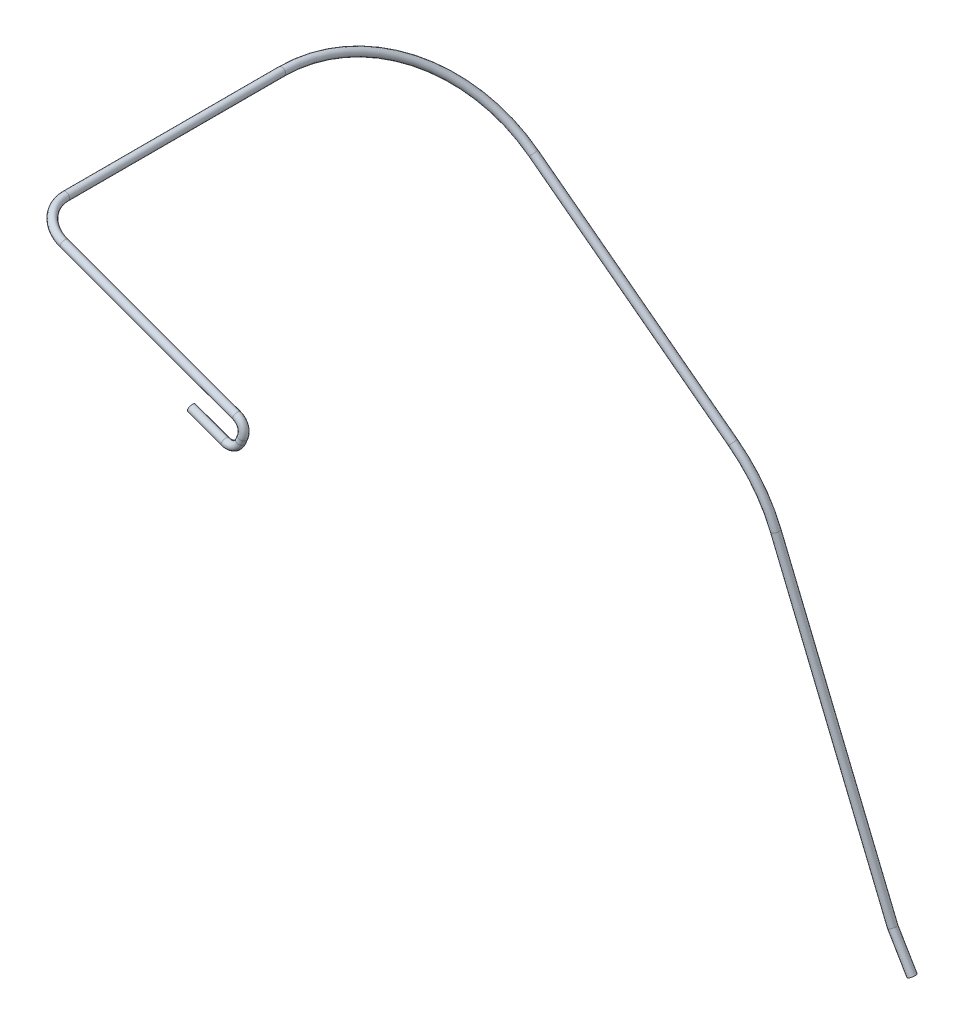
ISO-10303-21;
HEADER;
FILE_DESCRIPTION(('STEP AP214'),'2;1');
FILE_NAME('part.step','',(''),(''),'','','');
FILE_SCHEMA(('AUTOMOTIVE_DESIGN { 1 0 10303 214 1 1 1 1 }'));
ENDSEC;
DATA;
#1=APPLICATION_CONTEXT('core data for automotive mechanical design processes');
#2=APPLICATION_PROTOCOL_DEFINITION('international standard','automotive_design',2000,#1);
#3=PRODUCT_CONTEXT('',#1,'mechanical');
#4=PRODUCT('Part','Part','',(#3));
#5=PRODUCT_RELATED_PRODUCT_CATEGORY('part','',(#4));
#6=PRODUCT_DEFINITION_FORMATION('','',#4);
#7=PRODUCT_DEFINITION_CONTEXT('part definition',#1,'design');
#8=PRODUCT_DEFINITION('design','',#6,#7);
#9=PRODUCT_DEFINITION_SHAPE('','',#8);
#10=(LENGTH_UNIT() NAMED_UNIT(*) SI_UNIT(.MILLI.,.METRE.));
#11=(NAMED_UNIT(*) PLANE_ANGLE_UNIT() SI_UNIT($,.RADIAN.));
#12=(NAMED_UNIT(*) SI_UNIT($,.STERADIAN.) SOLID_ANGLE_UNIT());
#13=UNCERTAINTY_MEASURE_WITH_UNIT(LENGTH_MEASURE(1.E-05),#10,'distance_accuracy_value','');
#14=(GEOMETRIC_REPRESENTATION_CONTEXT(3) GLOBAL_UNCERTAINTY_ASSIGNED_CONTEXT((#13)) GLOBAL_UNIT_ASSIGNED_CONTEXT((#10,
#11,#12)) REPRESENTATION_CONTEXT('',''));
#15=CARTESIAN_POINT('',(0.,0.,0.));
#16=DIRECTION('',(0.,0.,1.));
#17=DIRECTION('',(1.,0.,0.));
#18=AXIS2_PLACEMENT_3D('',#15,#16,#17);
#19=CARTESIAN_POINT('',(345.043830556534,-756.942779989753,-586.820511540821));
#20=DIRECTION('',(-0.467929206614303,0.883139819589406,0.0332613387118007));
#21=DIRECTION('',(-0.883628741448249,-0.468188260517694,0.));
#22=AXIS2_PLACEMENT_3D('',#19,#20,#21);
#23=PLANE('',#22);
#24=CARTESIAN_POINT('',(345.043830556534,-756.942779989753,-586.820511540821));
#25=DIRECTION('',(-0.467929206614303,0.883139819589406,0.0332613387118007));
#26=DIRECTION('',(-0.883628741448249,-0.468188260517694,0.));
#27=AXIS2_PLACEMENT_3D('',#24,#25,#26);
#28=CIRCLE('',#27,4.00000000000004);
#29=CARTESIAN_POINT('',(341.509315590741,-758.815533031824,-586.820511540821));
#30=VERTEX_POINT('',#29);
#31=EDGE_CURVE('E83',#30,#30,#28,.T.);
#32=ORIENTED_EDGE('',*,*,#31,.T.);
#33=EDGE_LOOP('',(#32));
#34=FACE_BOUND('',#33,.T.);
#35=CARTESIAN_POINT('',(345.043830556534,-756.942779989753,-586.820511540821));
#36=DIRECTION('',(-0.467929206614303,0.883139819589406,0.0332613387118007));
#37=DIRECTION('',(-0.883628741448249,-0.468188260517694,0.));
#38=AXIS2_PLACEMENT_3D('',#35,#36,#37);
#39=CIRCLE('',#38,5.00000000000004);
#40=CARTESIAN_POINT('',(340.625686849293,-759.283721292342,-586.820511540821));
#41=VERTEX_POINT('',#40);
#42=EDGE_CURVE('E50',#41,#41,#39,.T.);
#43=ORIENTED_EDGE('',*,*,#42,.F.);
#44=EDGE_LOOP('',(#43));
#45=FACE_BOUND('',#44,.T.);
#46=ADVANCED_FACE('F47',(#34,#45),#23,.F.);
#47=CARTESIAN_POINT('',(-3.33066907387547E-13,-1.11022302462516E-13,0.));
#48=DIRECTION('',(-0.93969262078591,0.342020143325666,0.));
#49=DIRECTION('',(0.324832866004658,0.892470964444532,0.313016272399128));
#50=AXIS2_PLACEMENT_3D('',#47,#48,#49);
#51=PLANE('',#50);
#52=CARTESIAN_POINT('',(-3.33066907387547E-13,-1.11022302462516E-13,0.));
#53=DIRECTION('',(-0.93969262078591,0.342020143325666,0.));
#54=DIRECTION('',(-0.342020143325666,-0.939692620785909,0.));
#55=AXIS2_PLACEMENT_3D('',#52,#53,#54);
#56=CIRCLE('',#55,4.00000000000004);
#57=CARTESIAN_POINT('',(-1.36808057330301,-3.75877048314379,0.));
#58=VERTEX_POINT('',#57);
#59=EDGE_CURVE('E71',#58,#58,#56,.T.);
#60=ORIENTED_EDGE('',*,*,#59,.F.);
#61=EDGE_LOOP('',(#60));
#62=FACE_BOUND('',#61,.T.);
#63=CARTESIAN_POINT('',(-3.33066907387547E-13,-1.11022302462516E-13,0.));
#64=DIRECTION('',(-0.93969262078591,0.342020143325666,0.));
#65=DIRECTION('',(0.324832866004658,0.892470964444532,0.313016272399128));
#66=AXIS2_PLACEMENT_3D('',#63,#64,#65);
#67=CIRCLE('',#66,5.00000000000004);
#68=CARTESIAN_POINT('',(1.62416433002297,4.46235482222259,1.56508136199565));
#69=VERTEX_POINT('',#68);
#70=EDGE_CURVE('E11',#69,#69,#67,.T.);
#71=ORIENTED_EDGE('',*,*,#70,.T.);
#72=EDGE_LOOP('',(#71));
#73=FACE_BOUND('',#72,.T.);
#74=ADVANCED_FACE('F146',(#62,#73),#51,.T.);
#75=CARTESIAN_POINT('',(321.312445977381,-712.153674288312,-585.133637523492));
#76=DIRECTION('',(0.467929206614306,-0.883139819589404,-0.033261338711803));
#77=DIRECTION('',(0.883628741448247,0.468188260517697,0.));
#78=AXIS2_PLACEMENT_3D('',#75,#76,#77);
#79=CYLINDRICAL_SURFACE('',#78,5.00000000000004);
#80=CARTESIAN_POINT('',(321.647370225819,-712.785789010283,-585.157444605231));
#81=DIRECTION('',(0.389753622954663,-0.919780760214602,-0.0457762660421624));
#82=DIRECTION('',(-0.913981240403804,-0.380249150525052,-0.141594052540705));
#83=AXIS2_PLACEMENT_3D('',#80,#81,#82);
#84=ELLIPSE('',#83,5.01909918771678,5.00000000000004);
#85=CARTESIAN_POINT('',(317.06000772452,-714.694297212813,-585.868119199324));
#86=VERTEX_POINT('',#85);
#87=EDGE_CURVE('E62',#86,#86,#84,.T.);
#88=ORIENTED_EDGE('',*,*,#87,.T.);
#89=EDGE_LOOP('',(#88));
#90=FACE_BOUND('',#89,.T.);
#91=ORIENTED_EDGE('',*,*,#42,.T.);
#92=EDGE_LOOP('',(#91));
#93=FACE_BOUND('',#92,.T.);
#94=ADVANCED_FACE('F144',(#90,#93),#79,.T.);
#95=CARTESIAN_POINT('',(-3.33066907387547E-13,-1.11022302462516E-13,0.));
#96=DIRECTION('',(0.939692620785908,-0.342020143325669,0.));
#97=DIRECTION('',(0.342020143325669,0.939692620785908,0.));
#98=AXIS2_PLACEMENT_3D('',#95,#96,#97);
#99=CYLINDRICAL_SURFACE('',#98,5.00000000000004);
#100=CARTESIAN_POINT('',(43.4798706958059,-15.8253787230169,0.));
#101=DIRECTION('',(-0.93969262078591,0.342020143325666,0.));
#102=DIRECTION('',(0.324832866004658,0.892470964444532,0.313016272399128));
#103=AXIS2_PLACEMENT_3D('',#100,#101,#102);
#104=CIRCLE('',#103,5.00000000000004);
#105=CARTESIAN_POINT('',(41.7747755659462,-20.5100890903283,0.382281797282093));
#106=VERTEX_POINT('',#105);
#107=EDGE_CURVE('E54',#106,#106,#104,.T.);
#108=ORIENTED_EDGE('',*,*,#107,.T.);
#109=EDGE_LOOP('',(#108));
#110=FACE_BOUND('',#109,.T.);
#111=ORIENTED_EDGE('',*,*,#70,.F.);
#112=EDGE_LOOP('',(#111));
#113=FACE_BOUND('',#112,.T.);
#114=ADVANCED_FACE('F122',(#110,#113),#99,.T.);
#115=CARTESIAN_POINT('',(48.5951560853853,-1.77124762108241,-1.14684539184631));
#116=DIRECTION('',(0.0261496150194436,0.0718454767933526,0.997072928676068));
#117=DIRECTION('',(0.,-0.997414004020819,0.0718700534517508));
#118=AXIS2_PLACEMENT_3D('',#115,#116,#117);
#119=TOROIDAL_SURFACE('',#118,15.0000000000001,5.00000000000004);
#120=CARTESIAN_POINT('',(62.7095999836149,-6.8488902831555,-1.15113957734297));
#121=DIRECTION('',(-0.337498101469267,-0.938216147035957,0.0764558234907233));
#122=DIRECTION('',(-0.858482241468479,0.340096345750314,0.383852467349811));
#123=AXIS2_PLACEMENT_3D('',#120,#121,#122);
#124=CIRCLE('',#123,5.00000000000004);
#125=CARTESIAN_POINT('',(67.414414616358,-8.54143783717984,-1.15257097250853));
#126=VERTEX_POINT('',#125);
#127=EDGE_CURVE('E59',#126,#126,#124,.T.);
#128=CARTESIAN_POINT('',(48.5951560853853,-1.77124762108241,-1.14684539184631));
#129=DIRECTION('',(0.0261496150194436,0.0718454767933526,0.997072928676068));
#130=DIRECTION('',(0.,-0.997414004020819,0.0718700534517508));
#131=AXIS2_PLACEMENT_3D('',#128,#129,#130);
#132=CIRCLE('',#131,20.0000000000001);
#133=EDGE_CURVE('',#106,#126,#132,.T.);
#134=ORIENTED_EDGE('',*,*,#107,.F.);
#135=ORIENTED_EDGE('',*,*,#127,.T.);
#136=ORIENTED_EDGE('',*,*,#133,.T.);
#137=ORIENTED_EDGE('',*,*,#133,.F.);
#138=EDGE_LOOP('',(#134,#136,#135,#137));
#139=FACE_BOUND('',#138,.T.);
#140=ADVANCED_FACE('F107',(#139),#119,.T.);
#141=CARTESIAN_POINT('',(62.7095999836148,-6.8488902831555,-1.15113957734286));
#142=DIRECTION('',(0.33749810146927,0.938216147035956,-0.0764558234907223));
#143=DIRECTION('',(-0.940970395826116,0.338488868618812,0.));
#144=AXIS2_PLACEMENT_3D('',#141,#142,#143);
#145=CYLINDRICAL_SURFACE('',#144,5.00000000000004);
#146=CARTESIAN_POINT('',(64.7250193505446,-1.24619508318036,-1.60770673048227));
#147=DIRECTION('',(-0.337498101469267,-0.938216147035957,0.0764558234907233));
#148=DIRECTION('',(-0.858482241468479,0.340096345750314,0.383852467349811));
#149=AXIS2_PLACEMENT_3D('',#146,#147,#148);
#150=CIRCLE('',#149,5.00000000000004);
#151=CARTESIAN_POINT('',(69.4298339832879,-2.93874263720474,-1.60913812564779));
#152=VERTEX_POINT('',#151);
#153=EDGE_CURVE('E102',#152,#152,#150,.T.);
#154=ORIENTED_EDGE('',*,*,#153,.T.);
#155=EDGE_LOOP('',(#154));
#156=FACE_BOUND('',#155,.T.);
#157=ORIENTED_EDGE('',*,*,#127,.F.);
#158=EDGE_LOOP('',(#157));
#159=FACE_BOUND('',#158,.T.);
#160=ADVANCED_FACE('F110',(#156,#159),#145,.T.);
#161=CARTESIAN_POINT('',(50.6105754523151,3.83144757889267,-1.60341254498572));
#162=DIRECTION('',(0.0261496150194436,0.0718454767933526,0.997072928676068));
#163=DIRECTION('',(0.,-0.997414004020819,0.0718700534517508));
#164=AXIS2_PLACEMENT_3D('',#161,#162,#163);
#165=TOROIDAL_SURFACE('',#164,15.0000000000001,5.00000000000004);
#166=CARTESIAN_POINT('',(55.7258608418943,17.8855786808271,-2.75025793683226));
#167=DIRECTION('',(0.93969262078591,-0.342020143325666,0.));
#168=DIRECTION('',(-0.304712603921738,-0.837190998698202,0.454160170765711));
#169=AXIS2_PLACEMENT_3D('',#166,#167,#168);
#170=CIRCLE('',#169,5.00000000000004);
#171=CARTESIAN_POINT('',(57.4309559717541,22.5702890481386,-3.13253973411444));
#172=VERTEX_POINT('',#171);
#173=EDGE_CURVE('E99',#172,#172,#170,.T.);
#174=CARTESIAN_POINT('',(50.6105754523151,3.83144757889267,-1.60341254498572));
#175=DIRECTION('',(0.0261496150194436,0.0718454767933526,0.997072928676068));
#176=DIRECTION('',(0.,-0.997414004020819,0.0718700534517508));
#177=AXIS2_PLACEMENT_3D('',#174,#175,#176);
#178=CIRCLE('',#177,20.0000000000002);
#179=EDGE_CURVE('',#152,#172,#178,.T.);
#180=ORIENTED_EDGE('',*,*,#153,.F.);
#181=ORIENTED_EDGE('',*,*,#173,.T.);
#182=ORIENTED_EDGE('',*,*,#179,.T.);
#183=ORIENTED_EDGE('',*,*,#179,.F.);
#184=EDGE_LOOP('',(#180,#182,#181,#183));
#185=FACE_BOUND('',#184,.T.);
#186=ADVANCED_FACE('F112',(#185),#165,.T.);
#187=CARTESIAN_POINT('',(55.7258608418943,17.885578680827,-2.75025793683215));
#188=DIRECTION('',(-0.939692620785908,0.34202014332567,0.));
#189=DIRECTION('',(-0.34202014332567,-0.939692620785908,0.));
#190=AXIS2_PLACEMENT_3D('',#187,#188,#189);
#191=CYLINDRICAL_SURFACE('',#190,5.00000000000004);
#192=CARTESIAN_POINT('',(-167.617948508894,99.1760772921397,-2.75025793683215));
#193=DIRECTION('',(0.93969262078591,-0.342020143325666,0.));
#194=DIRECTION('',(-0.304712603921738,-0.837190998698202,0.454160170765711));
#195=AXIS2_PLACEMENT_3D('',#192,#193,#194);
#196=CIRCLE('',#195,5.00000000000004);
#197=CARTESIAN_POINT('',(-167.617948508894,99.1760772921397,2.249742063168));
#198=VERTEX_POINT('',#197);
#199=EDGE_CURVE('E96',#198,#198,#196,.T.);
#200=ORIENTED_EDGE('',*,*,#199,.T.);
#201=EDGE_LOOP('',(#200));
#202=FACE_BOUND('',#201,.T.);
#203=ORIENTED_EDGE('',*,*,#173,.F.);
#204=EDGE_LOOP('',(#203));
#205=FACE_BOUND('',#204,.T.);
#206=ADVANCED_FACE('F119',(#202,#205),#191,.T.);
#207=CARTESIAN_POINT('',(-167.617948508894,99.1760772921399,-42.750257936832));
#208=DIRECTION('',(-0.342020143325669,-0.939692620785908,0.));
#209=DIRECTION('',(0.939692620785909,-0.342020143325669,0.));
#210=AXIS2_PLACEMENT_3D('',#207,#208,#209);
#211=TOROIDAL_SURFACE('',#210,39.9999999999999,5.00000000000004);
#212=CARTESIAN_POINT('',(-205.20565334033,112.856883025167,-42.7502579368317));
#213=DIRECTION('',(0.,0.,1.));
#214=DIRECTION('',(-0.731483565045148,-0.681859072000103,0.));
#215=AXIS2_PLACEMENT_3D('',#212,#213,#214);
#216=CIRCLE('',#215,5.00000000000004);
#217=CARTESIAN_POINT('',(-209.90411644426,114.566983741795,-42.7502579368317));
#218=VERTEX_POINT('',#217);
#219=EDGE_CURVE('E93',#218,#218,#216,.T.);
#220=CARTESIAN_POINT('',(-167.617948508894,99.1760772921399,-42.750257936832));
#221=DIRECTION('',(-0.342020143325669,-0.939692620785908,0.));
#222=DIRECTION('',(0.939692620785909,-0.342020143325669,0.));
#223=AXIS2_PLACEMENT_3D('',#220,#221,#222);
#224=CIRCLE('',#223,45.);
#225=EDGE_CURVE('',#198,#218,#224,.T.);
#226=ORIENTED_EDGE('',*,*,#199,.F.);
#227=ORIENTED_EDGE('',*,*,#219,.T.);
#228=ORIENTED_EDGE('',*,*,#225,.T.);
#229=ORIENTED_EDGE('',*,*,#225,.F.);
#230=EDGE_LOOP('',(#226,#228,#227,#229));
#231=FACE_BOUND('',#230,.T.);
#232=ADVANCED_FACE('F182',(#231),#211,.T.);
#233=CARTESIAN_POINT('',(-205.20565334033,112.856883025166,-42.7502579368316));
#234=DIRECTION('',(0.,0.,-1.));
#235=DIRECTION('',(-1.,0.,0.));
#236=AXIS2_PLACEMENT_3D('',#233,#234,#235);
#237=CYLINDRICAL_SURFACE('',#236,5.00000000000004);
#238=CARTESIAN_POINT('',(-205.20565334033,112.856883025167,-322.093656878126));
#239=DIRECTION('',(0.,0.,1.));
#240=DIRECTION('',(-0.731483565045147,-0.681859072000103,0.));
#241=AXIS2_PLACEMENT_3D('',#238,#239,#240);
#242=CIRCLE('',#241,5.00000000000004);
#243=CARTESIAN_POINT('',(-208.722785401874,116.410723491713,-322.093656878126));
#244=VERTEX_POINT('',#243);
#245=EDGE_CURVE('E90',#244,#244,#242,.T.);
#246=ORIENTED_EDGE('',*,*,#245,.T.);
#247=EDGE_LOOP('',(#246));
#248=FACE_BOUND('',#247,.T.);
#249=ORIENTED_EDGE('',*,*,#219,.F.);
#250=EDGE_LOOP('',(#249));
#251=FACE_BOUND('',#250,.T.);
#252=ADVANCED_FACE('F178',(#248,#251),#237,.T.);
#253=CARTESIAN_POINT('',(-64.5203708785941,-29.2967356366934,-322.093656878126));
#254=DIRECTION('',(-0.710768093309301,-0.70342641230868,0.));
#255=DIRECTION('',(0.70342641230868,-0.710768093309301,0.));
#256=AXIS2_PLACEMENT_3D('',#253,#254,#255);
#257=TOROIDAL_SURFACE('',#256,200.,5.00000000000004);
#258=CARTESIAN_POINT('',(-78.7816366389307,-14.8866246495564,-521.063415887508));
#259=DIRECTION('',(-0.699802918689459,0.707106781186549,0.101369990597381));
#260=DIRECTION('',(-0.712582424024966,-0.700957484754028,-0.0297471601671272));
#261=AXIS2_PLACEMENT_3D('',#258,#259,#260);
#262=CIRCLE('',#261,5.00000000000004);
#263=CARTESIAN_POINT('',(-79.1381682829391,-14.526371874878,-526.037659862743));
#264=VERTEX_POINT('',#263);
#265=EDGE_CURVE('E87',#264,#264,#262,.T.);
#266=CARTESIAN_POINT('',(-64.5203708785941,-29.2967356366934,-322.093656878126));
#267=DIRECTION('',(-0.710768093309301,-0.70342641230868,0.));
#268=DIRECTION('',(0.70342641230868,-0.710768093309301,0.));
#269=AXIS2_PLACEMENT_3D('',#266,#267,#268);
#270=CIRCLE('',#269,205.);
#271=EDGE_CURVE('',#244,#264,#270,.T.);
#272=ORIENTED_EDGE('',*,*,#245,.F.);
#273=ORIENTED_EDGE('',*,*,#265,.T.);
#274=ORIENTED_EDGE('',*,*,#271,.T.);
#275=ORIENTED_EDGE('',*,*,#271,.F.);
#276=EDGE_LOOP('',(#272,#274,#273,#275));
#277=FACE_BOUND('',#276,.T.);
#278=ADVANCED_FACE('F174',(#277),#257,.T.);
#279=CARTESIAN_POINT('',(-78.7816366389308,-14.8866246495566,-521.063415887508));
#280=DIRECTION('',(0.699802918689461,-0.707106781186547,-0.101369990597383));
#281=DIRECTION('',(0.710768093309301,0.70342641230868,0.));
#282=AXIS2_PLACEMENT_3D('',#279,#280,#281);
#283=CYLINDRICAL_SURFACE('',#282,5.00000000000004);
#284=CARTESIAN_POINT('',(146.440789385117,-242.459703388829,-553.688022899913));
#285=DIRECTION('',(-0.699802918689459,0.707106781186549,0.101369990597381));
#286=DIRECTION('',(-0.712582424024966,-0.700957484754029,-0.0297471601671273));
#287=AXIS2_PLACEMENT_3D('',#284,#285,#286);
#288=CIRCLE('',#287,5.00000000000004);
#289=CARTESIAN_POINT('',(149.959202803323,-238.92567043616,-554.050484081333));
#290=VERTEX_POINT('',#289);
#291=EDGE_CURVE('E68',#290,#290,#288,.T.);
#292=ORIENTED_EDGE('',*,*,#291,.T.);
#293=EDGE_LOOP('',(#292));
#294=FACE_BOUND('',#293,.T.);
#295=ORIENTED_EDGE('',*,*,#265,.F.);
#296=EDGE_LOOP('',(#295));
#297=FACE_BOUND('',#296,.T.);
#298=ADVANCED_FACE('F137',(#294,#297),#283,.T.);
#299=CARTESIAN_POINT('',(5.70425265688354,-383.8210214956,-539.189575643084));
#300=DIRECTION('',(-0.122908729296481,0.0206020284902761,-0.992204112410753));
#301=DIRECTION('',(-0.992414746796681,0.,0.12293482151319));
#302=AXIS2_PLACEMENT_3D('',#299,#300,#301);
#303=TOROIDAL_SURFACE('',#302,200.,5.00000000000004);
#304=CARTESIAN_POINT('',(194.347006474396,-321.155510876876,-561.256410736497));
#305=DIRECTION('',(-0.308611778884662,0.94942161387576,0.0579428083474728));
#306=DIRECTION('',(-0.95084802942752,-0.309557258373422,0.00789485415524105));
#307=AXIS2_PLACEMENT_3D('',#304,#305,#306);
#308=CIRCLE('',#307,5.00000000000004);
#309=CARTESIAN_POINT('',(199.063075319834,-319.588873111407,-561.808081613833));
#310=VERTEX_POINT('',#309);
#311=EDGE_CURVE('E64',#310,#310,#308,.T.);
#312=CARTESIAN_POINT('',(5.70425265688354,-383.8210214956,-539.189575643084));
#313=DIRECTION('',(-0.122908729296481,0.0206020284902761,-0.992204112410753));
#314=DIRECTION('',(-0.992414746796681,0.,0.12293482151319));
#315=AXIS2_PLACEMENT_3D('',#312,#313,#314);
#316=CIRCLE('',#315,205.);
#317=EDGE_CURVE('',#290,#310,#316,.T.);
#318=ORIENTED_EDGE('',*,*,#291,.F.);
#319=ORIENTED_EDGE('',*,*,#311,.T.);
#320=ORIENTED_EDGE('',*,*,#317,.T.);
#321=ORIENTED_EDGE('',*,*,#317,.F.);
#322=EDGE_LOOP('',(#318,#320,#319,#321));
#323=FACE_BOUND('',#322,.T.);
#324=ADVANCED_FACE('F127',(#323),#303,.T.);
#325=CARTESIAN_POINT('',(194.347006474396,-321.155510876876,-561.256410736497));
#326=DIRECTION('',(0.308611778884664,-0.949421613875759,-0.0579428083474757));
#327=DIRECTION('',(0.951019417681853,0.309131148854444,0.));
#328=AXIS2_PLACEMENT_3D('',#325,#326,#327);
#329=CYLINDRICAL_SURFACE('',#328,5.00000000000004);
#330=ORIENTED_EDGE('',*,*,#311,.F.);
#331=EDGE_LOOP('',(#330));
#332=FACE_BOUND('',#331,.T.);
#333=ORIENTED_EDGE('',*,*,#87,.F.);
#334=EDGE_LOOP('',(#333));
#335=FACE_BOUND('',#334,.T.);
#336=ADVANCED_FACE('F124',(#332,#335),#329,.T.);
#337=CARTESIAN_POINT('',(321.312445977381,-712.153674288312,-585.133637523492));
#338=DIRECTION('',(0.467929206614306,-0.883139819589404,-0.033261338711803));
#339=DIRECTION('',(0.883628741448247,0.468188260517697,0.));
#340=AXIS2_PLACEMENT_3D('',#337,#338,#339);
#341=CYLINDRICAL_SURFACE('',#340,4.00000000000004);
#342=CARTESIAN_POINT('',(321.647370225819,-712.785789010284,-585.157444605231));
#343=DIRECTION('',(0.389753622954663,-0.919780760214602,-0.0457762660421624));
#344=DIRECTION('',(0.913981240403804,0.380249150525052,0.141594052540705));
#345=AXIS2_PLACEMENT_3D('',#342,#343,#344);
#346=ELLIPSE('',#345,4.01527935017343,4.00000000000004);
#347=CARTESIAN_POINT('',(325.317260226858,-711.25898244826,-584.588904929957));
#348=VERTEX_POINT('',#347);
#349=EDGE_CURVE('E471',#348,#348,#346,.T.);
#350=ORIENTED_EDGE('',*,*,#349,.F.);
#351=EDGE_LOOP('',(#350));
#352=FACE_BOUND('',#351,.T.);
#353=ORIENTED_EDGE('',*,*,#31,.F.);
#354=EDGE_LOOP('',(#353));
#355=FACE_BOUND('',#354,.T.);
#356=ADVANCED_FACE('F126',(#352,#355),#341,.F.);
#357=CARTESIAN_POINT('',(-3.33066907387547E-13,-1.11022302462516E-13,0.));
#358=DIRECTION('',(0.939692620785908,-0.342020143325669,0.));
#359=DIRECTION('',(0.342020143325669,0.939692620785908,0.));
#360=AXIS2_PLACEMENT_3D('',#357,#358,#359);
#361=CYLINDRICAL_SURFACE('',#360,4.00000000000004);
#362=CARTESIAN_POINT('',(43.4798706958059,-15.8253787230169,0.));
#363=DIRECTION('',(0.939692620785908,-0.342020143325669,0.));
#364=DIRECTION('',(0.342020143325669,0.939692620785908,0.));
#365=AXIS2_PLACEMENT_3D('',#362,#363,#364);
#366=CIRCLE('',#365,4.00000000000004);
#367=CARTESIAN_POINT('',(42.1157945919182,-19.573147016866,0.305825437825672));
#368=VERTEX_POINT('',#367);
#369=EDGE_CURVE('E75',#368,#368,#366,.F.);
#370=ORIENTED_EDGE('',*,*,#369,.F.);
#371=EDGE_LOOP('',(#370));
#372=FACE_BOUND('',#371,.T.);
#373=ORIENTED_EDGE('',*,*,#59,.T.);
#374=EDGE_LOOP('',(#373));
#375=FACE_BOUND('',#374,.T.);
#376=ADVANCED_FACE('F134',(#372,#375),#361,.F.);
#377=CARTESIAN_POINT('',(48.5951560853853,-1.77124762108241,-1.14684539184631));
#378=DIRECTION('',(0.0261496150194436,0.0718454767933526,0.997072928676068));
#379=DIRECTION('',(0.,-0.997414004020819,0.0718700534517508));
#380=AXIS2_PLACEMENT_3D('',#377,#378,#379);
#381=TOROIDAL_SURFACE('',#380,15.0000000000001,4.00000000000004);
#382=CARTESIAN_POINT('',(62.7095999836148,-6.84889028315542,-1.15113957734287));
#383=DIRECTION('',(-0.33749810146928,-0.938216147035952,0.0764558234907223));
#384=DIRECTION('',(0.940970395826112,-0.338488868618822,0.));
#385=AXIS2_PLACEMENT_3D('',#382,#383,#384);
#386=CIRCLE('',#385,4.00000000000004);
#387=CARTESIAN_POINT('',(66.4734516898094,-8.20292832637489,-1.15228469347528));
#388=VERTEX_POINT('',#387);
#389=EDGE_CURVE('E80',#388,#388,#386,.T.);
#390=CARTESIAN_POINT('',(48.5951560853853,-1.77124762108241,-1.14684539184631));
#391=DIRECTION('',(0.0261496150194436,0.0718454767933526,0.997072928676068));
#392=DIRECTION('',(0.,-0.997414004020819,0.0718700534517508));
#393=AXIS2_PLACEMENT_3D('',#390,#391,#392);
#394=CIRCLE('',#393,19.0000000000001);
#395=EDGE_CURVE('',#368,#388,#394,.T.);
#396=ORIENTED_EDGE('',*,*,#369,.T.);
#397=ORIENTED_EDGE('',*,*,#389,.F.);
#398=ORIENTED_EDGE('',*,*,#395,.T.);
#399=ORIENTED_EDGE('',*,*,#395,.F.);
#400=EDGE_LOOP('',(#396,#398,#397,#399));
#401=FACE_BOUND('',#400,.T.);
#402=ADVANCED_FACE('F241',(#401),#381,.F.);
#403=CARTESIAN_POINT('',(62.7095999836148,-6.8488902831555,-1.15113957734286));
#404=DIRECTION('',(0.33749810146927,0.938216147035956,-0.0764558234907223));
#405=DIRECTION('',(-0.940970395826116,0.338488868618812,0.));
#406=AXIS2_PLACEMENT_3D('',#403,#404,#405);
#407=CYLINDRICAL_SURFACE('',#406,4.00000000000004);
#408=CARTESIAN_POINT('',(64.7250193505447,-1.24619508318038,-1.60770673048225));
#409=DIRECTION('',(0.33749810146927,0.938216147035956,-0.0764558234907223));
#410=DIRECTION('',(-0.940970395826116,0.338488868618812,0.));
#411=AXIS2_PLACEMENT_3D('',#408,#409,#410);
#412=CIRCLE('',#411,4.00000000000004);
#413=CARTESIAN_POINT('',(68.4888710567393,-2.60023312639989,-1.60885184661466));
#414=VERTEX_POINT('',#413);
#415=EDGE_CURVE('E454',#414,#414,#412,.F.);
#416=ORIENTED_EDGE('',*,*,#415,.F.);
#417=EDGE_LOOP('',(#416));
#418=FACE_BOUND('',#417,.T.);
#419=ORIENTED_EDGE('',*,*,#389,.T.);
#420=EDGE_LOOP('',(#419));
#421=FACE_BOUND('',#420,.T.);
#422=ADVANCED_FACE('F252',(#418,#421),#407,.F.);
#423=CARTESIAN_POINT('',(50.6105754523151,3.83144757889267,-1.60341254498572));
#424=DIRECTION('',(0.0261496150194436,0.0718454767933526,0.997072928676068));
#425=DIRECTION('',(0.,-0.997414004020819,0.0718700534517508));
#426=AXIS2_PLACEMENT_3D('',#423,#424,#425);
#427=TOROIDAL_SURFACE('',#426,15.0000000000001,4.00000000000004);
#428=CARTESIAN_POINT('',(55.7258608418943,17.8855786808272,-2.75025793683203));
#429=DIRECTION('',(0.939692620785905,-0.342020143325678,0.));
#430=DIRECTION('',(0.342020143325678,0.939692620785905,0.));
#431=AXIS2_PLACEMENT_3D('',#428,#429,#430);
#432=CIRCLE('',#431,4.00000000000004);
#433=CARTESIAN_POINT('',(57.0899369457821,21.6333469746764,-3.05608337465771));
#434=VERTEX_POINT('',#433);
#435=EDGE_CURVE('E451',#434,#434,#432,.T.);
#436=CARTESIAN_POINT('',(50.6105754523151,3.83144757889267,-1.60341254498572));
#437=DIRECTION('',(0.0261496150194436,0.0718454767933526,0.997072928676068));
#438=DIRECTION('',(0.,-0.997414004020819,0.0718700534517508));
#439=AXIS2_PLACEMENT_3D('',#436,#437,#438);
#440=CIRCLE('',#439,19.0000000000002);
#441=EDGE_CURVE('',#414,#434,#440,.T.);
#442=ORIENTED_EDGE('',*,*,#415,.T.);
#443=ORIENTED_EDGE('',*,*,#435,.F.);
#444=ORIENTED_EDGE('',*,*,#441,.T.);
#445=ORIENTED_EDGE('',*,*,#441,.F.);
#446=EDGE_LOOP('',(#442,#444,#443,#445));
#447=FACE_BOUND('',#446,.T.);
#448=ADVANCED_FACE('F263',(#447),#427,.F.);
#449=CARTESIAN_POINT('',(55.7258608418943,17.885578680827,-2.75025793683215));
#450=DIRECTION('',(-0.939692620785908,0.34202014332567,0.));
#451=DIRECTION('',(-0.34202014332567,-0.939692620785908,0.));
#452=AXIS2_PLACEMENT_3D('',#449,#450,#451);
#453=CYLINDRICAL_SURFACE('',#452,4.00000000000004);
#454=CARTESIAN_POINT('',(-167.617948508894,99.1760772921397,-2.75025793683215));
#455=DIRECTION('',(-0.939692620785908,0.34202014332567,0.));
#456=DIRECTION('',(-0.34202014332567,-0.939692620785908,0.));
#457=AXIS2_PLACEMENT_3D('',#454,#455,#456);
#458=CIRCLE('',#457,4.00000000000004);
#459=CARTESIAN_POINT('',(-167.617948508894,99.1760772921397,1.249742063168));
#460=VERTEX_POINT('',#459);
#461=EDGE_CURVE('E448',#460,#460,#458,.F.);
#462=ORIENTED_EDGE('',*,*,#461,.F.);
#463=EDGE_LOOP('',(#462));
#464=FACE_BOUND('',#463,.T.);
#465=ORIENTED_EDGE('',*,*,#435,.T.);
#466=EDGE_LOOP('',(#465));
#467=FACE_BOUND('',#466,.T.);
#468=ADVANCED_FACE('F274',(#464,#467),#453,.F.);
#469=CARTESIAN_POINT('',(-167.617948508894,99.1760772921399,-42.750257936832));
#470=DIRECTION('',(-0.342020143325669,-0.939692620785908,0.));
#471=DIRECTION('',(0.939692620785909,-0.342020143325669,0.));
#472=AXIS2_PLACEMENT_3D('',#469,#470,#471);
#473=TOROIDAL_SURFACE('',#472,39.9999999999999,4.00000000000004);
#474=CARTESIAN_POINT('',(-205.20565334033,112.856883025167,-42.7502579368317));
#475=DIRECTION('',(0.,0.,1.));
#476=DIRECTION('',(1.,0.,0.));
#477=AXIS2_PLACEMENT_3D('',#474,#475,#476);
#478=CIRCLE('',#477,4.00000000000004);
#479=CARTESIAN_POINT('',(-208.964423823474,114.224963598469,-42.7502579368317));
#480=VERTEX_POINT('',#479);
#481=EDGE_CURVE('E440',#480,#480,#478,.T.);
#482=CARTESIAN_POINT('',(-167.617948508894,99.1760772921399,-42.750257936832));
#483=DIRECTION('',(-0.342020143325669,-0.939692620785908,0.));
#484=DIRECTION('',(0.939692620785909,-0.342020143325669,0.));
#485=AXIS2_PLACEMENT_3D('',#482,#483,#484);
#486=CIRCLE('',#485,44.);
#487=EDGE_CURVE('',#460,#480,#486,.T.);
#488=ORIENTED_EDGE('',*,*,#461,.T.);
#489=ORIENTED_EDGE('',*,*,#481,.F.);
#490=ORIENTED_EDGE('',*,*,#487,.T.);
#491=ORIENTED_EDGE('',*,*,#487,.F.);
#492=EDGE_LOOP('',(#488,#490,#489,#491));
#493=FACE_BOUND('',#492,.T.);
#494=ADVANCED_FACE('F285',(#493),#473,.F.);
#495=CARTESIAN_POINT('',(-205.20565334033,112.856883025166,-42.7502579368316));
#496=DIRECTION('',(0.,0.,-1.));
#497=DIRECTION('',(-1.,0.,0.));
#498=AXIS2_PLACEMENT_3D('',#495,#496,#497);
#499=CYLINDRICAL_SURFACE('',#498,4.00000000000004);
#500=CARTESIAN_POINT('',(-205.20565334033,112.856883025167,-322.093656878126));
#501=DIRECTION('',(0.,0.,-1.));
#502=DIRECTION('',(-1.,0.,0.));
#503=AXIS2_PLACEMENT_3D('',#500,#501,#502);
#504=CIRCLE('',#503,4.00000000000004);
#505=CARTESIAN_POINT('',(-208.019358989565,115.699955398404,-322.093656878126));
#506=VERTEX_POINT('',#505);
#507=EDGE_CURVE('E437',#506,#506,#504,.F.);
#508=ORIENTED_EDGE('',*,*,#507,.F.);
#509=EDGE_LOOP('',(#508));
#510=FACE_BOUND('',#509,.T.);
#511=ORIENTED_EDGE('',*,*,#481,.T.);
#512=EDGE_LOOP('',(#511));
#513=FACE_BOUND('',#512,.T.);
#514=ADVANCED_FACE('F296',(#510,#513),#499,.F.);
#515=CARTESIAN_POINT('',(-64.5203708785941,-29.2967356366934,-322.093656878126));
#516=DIRECTION('',(-0.710768093309301,-0.70342641230868,0.));
#517=DIRECTION('',(0.70342641230868,-0.710768093309301,0.));
#518=AXIS2_PLACEMENT_3D('',#515,#516,#517);
#519=TOROIDAL_SURFACE('',#518,200.,4.00000000000004);
#520=CARTESIAN_POINT('',(-78.7816366389307,-14.8866246495564,-521.063415887508));
#521=DIRECTION('',(-0.69980291868946,0.707106781186547,0.101369990597385));
#522=DIRECTION('',(-0.710768093309301,-0.70342641230868,0.));
#523=AXIS2_PLACEMENT_3D('',#520,#521,#522);
#524=CIRCLE('',#523,4.00000000000004);
#525=CARTESIAN_POINT('',(-79.0668619541374,-14.5984224298137,-525.042811067696));
#526=VERTEX_POINT('',#525);
#527=EDGE_CURVE('E436',#526,#526,#524,.T.);
#528=CARTESIAN_POINT('',(-64.5203708785941,-29.2967356366934,-322.093656878126));
#529=DIRECTION('',(-0.710768093309301,-0.70342641230868,0.));
#530=DIRECTION('',(0.70342641230868,-0.710768093309301,0.));
#531=AXIS2_PLACEMENT_3D('',#528,#529,#530);
#532=CIRCLE('',#531,204.);
#533=EDGE_CURVE('',#506,#526,#532,.T.);
#534=ORIENTED_EDGE('',*,*,#507,.T.);
#535=ORIENTED_EDGE('',*,*,#527,.F.);
#536=ORIENTED_EDGE('',*,*,#533,.T.);
#537=ORIENTED_EDGE('',*,*,#533,.F.);
#538=EDGE_LOOP('',(#534,#536,#535,#537));
#539=FACE_BOUND('',#538,.T.);
#540=ADVANCED_FACE('F307',(#539),#519,.F.);
#541=CARTESIAN_POINT('',(-78.7816366389308,-14.8866246495566,-521.063415887508));
#542=DIRECTION('',(0.699802918689461,-0.707106781186547,-0.101369990597383));
#543=DIRECTION('',(0.710768093309301,0.70342641230868,0.));
#544=AXIS2_PLACEMENT_3D('',#541,#542,#543);
#545=CYLINDRICAL_SURFACE('',#544,4.00000000000004);
#546=CARTESIAN_POINT('',(146.440789385117,-242.459703388829,-553.688022899913));
#547=DIRECTION('',(0.699802918689461,-0.707106781186547,-0.101369990597383));
#548=DIRECTION('',(0.710768093309301,0.70342641230868,0.));
#549=AXIS2_PLACEMENT_3D('',#546,#547,#548);
#550=CIRCLE('',#549,4.00000000000004);
#551=CARTESIAN_POINT('',(149.255520119682,-239.632477026694,-553.977991845049));
#552=VERTEX_POINT('',#551);
#553=EDGE_CURVE('E433',#552,#552,#550,.F.);
#554=ORIENTED_EDGE('',*,*,#553,.F.);
#555=EDGE_LOOP('',(#554));
#556=FACE_BOUND('',#555,.T.);
#557=ORIENTED_EDGE('',*,*,#527,.T.);
#558=EDGE_LOOP('',(#557));
#559=FACE_BOUND('',#558,.T.);
#560=ADVANCED_FACE('F165',(#556,#559),#545,.F.);
#561=CARTESIAN_POINT('',(5.70425265688354,-383.8210214956,-539.189575643084));
#562=DIRECTION('',(-0.122908729296481,0.0206020284902761,-0.992204112410753));
#563=DIRECTION('',(-0.992414746796681,0.,0.12293482151319));
#564=AXIS2_PLACEMENT_3D('',#561,#562,#563);
#565=TOROIDAL_SURFACE('',#564,200.,4.00000000000004);
#566=CARTESIAN_POINT('',(194.347006474396,-321.155510876875,-561.256410736497));
#567=DIRECTION('',(-0.308611778884665,0.949421613875759,0.0579428083474752));
#568=DIRECTION('',(-0.951019417681853,-0.309131148854446,0.));
#569=AXIS2_PLACEMENT_3D('',#566,#567,#568);
#570=CIRCLE('',#569,4.00000000000004);
#571=CARTESIAN_POINT('',(198.119861550747,-319.902200664501,-561.697747438366));
#572=VERTEX_POINT('',#571);
#573=EDGE_CURVE('E442',#572,#572,#570,.T.);
#574=CARTESIAN_POINT('',(5.70425265688354,-383.8210214956,-539.189575643084));
#575=DIRECTION('',(-0.122908729296481,0.0206020284902761,-0.992204112410753));
#576=DIRECTION('',(-0.992414746796681,0.,0.12293482151319));
#577=AXIS2_PLACEMENT_3D('',#574,#575,#576);
#578=CIRCLE('',#577,204.);
#579=EDGE_CURVE('',#552,#572,#578,.T.);
#580=ORIENTED_EDGE('',*,*,#553,.T.);
#581=ORIENTED_EDGE('',*,*,#573,.F.);
#582=ORIENTED_EDGE('',*,*,#579,.T.);
#583=ORIENTED_EDGE('',*,*,#579,.F.);
#584=EDGE_LOOP('',(#580,#582,#581,#583));
#585=FACE_BOUND('',#584,.T.);
#586=ADVANCED_FACE('F159',(#585),#565,.F.);
#587=CARTESIAN_POINT('',(194.347006474396,-321.155510876876,-561.256410736497));
#588=DIRECTION('',(0.308611778884664,-0.949421613875759,-0.0579428083474757));
#589=DIRECTION('',(0.951019417681853,0.309131148854444,0.));
#590=AXIS2_PLACEMENT_3D('',#587,#588,#589);
#591=CYLINDRICAL_SURFACE('',#590,4.00000000000004);
#592=ORIENTED_EDGE('',*,*,#573,.T.);
#593=EDGE_LOOP('',(#592));
#594=FACE_BOUND('',#593,.T.);
#595=ORIENTED_EDGE('',*,*,#349,.T.);
#596=EDGE_LOOP('',(#595));
#597=FACE_BOUND('',#596,.T.);
#598=ADVANCED_FACE('F153',(#594,#597),#591,.F.);
#599=CLOSED_SHELL('',(#46,#74,#94,#114,#140,#160,#186,#206,#232,#252,#278,#298,#324,#336,#356,
#376,#402,#422,#448,#468,#494,#514,#540,#560,#586,#598));
#600=MANIFOLD_SOLID_BREP('B2',#599);
#601=ADVANCED_BREP_SHAPE_REPRESENTATION('',(#18,#600),#14);
#602=SHAPE_DEFINITION_REPRESENTATION(#9,#601);
ENDSEC;
END-ISO-10303-21;
